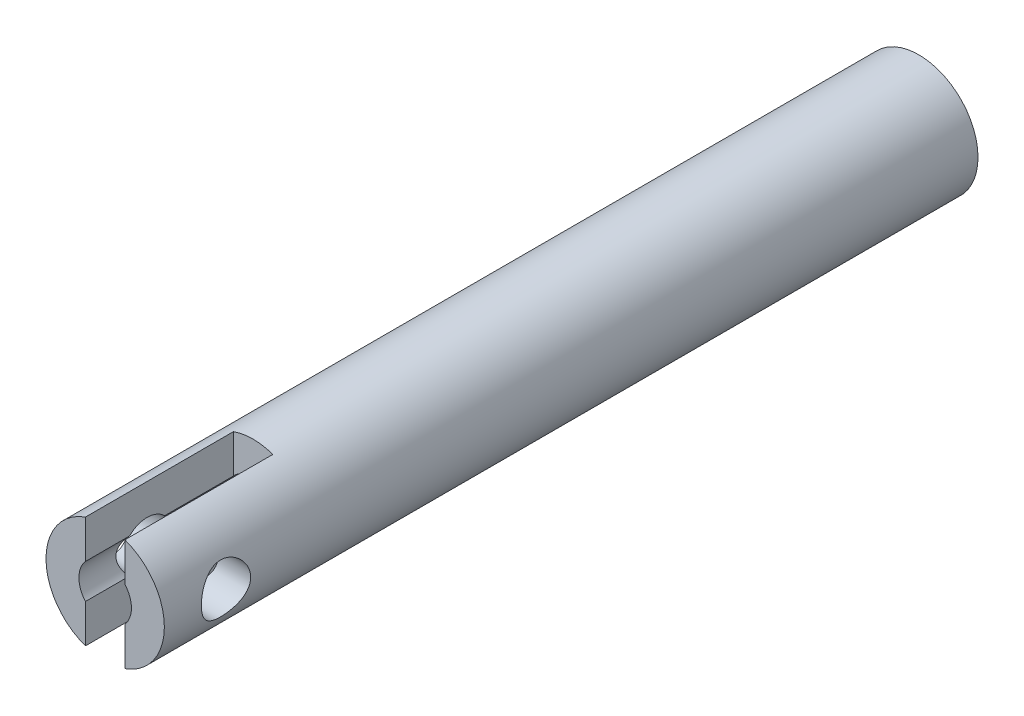
ISO-10303-21;
HEADER;
FILE_DESCRIPTION(('STEP AP214'),'2;1');
FILE_NAME('part.step','',(''),(''),'','','');
FILE_SCHEMA(('AUTOMOTIVE_DESIGN { 1 0 10303 214 1 1 1 1 }'));
ENDSEC;
DATA;
#1=APPLICATION_CONTEXT('core data for automotive mechanical design processes');
#2=APPLICATION_PROTOCOL_DEFINITION('international standard','automotive_design',2000,#1);
#3=PRODUCT_CONTEXT('',#1,'mechanical');
#4=PRODUCT('Part','Part','',(#3));
#5=PRODUCT_RELATED_PRODUCT_CATEGORY('part','',(#4));
#6=PRODUCT_DEFINITION_FORMATION('','',#4);
#7=PRODUCT_DEFINITION_CONTEXT('part definition',#1,'design');
#8=PRODUCT_DEFINITION('design','',#6,#7);
#9=PRODUCT_DEFINITION_SHAPE('','',#8);
#10=(LENGTH_UNIT() NAMED_UNIT(*) SI_UNIT(.MILLI.,.METRE.));
#11=(NAMED_UNIT(*) PLANE_ANGLE_UNIT() SI_UNIT($,.RADIAN.));
#12=(NAMED_UNIT(*) SI_UNIT($,.STERADIAN.) SOLID_ANGLE_UNIT());
#13=UNCERTAINTY_MEASURE_WITH_UNIT(LENGTH_MEASURE(1.E-05),#10,'distance_accuracy_value','');
#14=(GEOMETRIC_REPRESENTATION_CONTEXT(3) GLOBAL_UNCERTAINTY_ASSIGNED_CONTEXT((#13)) GLOBAL_UNIT_ASSIGNED_CONTEXT((#10,
#11,#12)) REPRESENTATION_CONTEXT('',''));
#15=CARTESIAN_POINT('',(0.,0.,0.));
#16=DIRECTION('',(0.,0.,1.));
#17=DIRECTION('',(1.,0.,0.));
#18=AXIS2_PLACEMENT_3D('',#15,#16,#17);
#19=CARTESIAN_POINT('',(0.,0.,41.91));
#20=DIRECTION('',(0.,0.,1.));
#21=DIRECTION('',(1.,0.,0.));
#22=AXIS2_PLACEMENT_3D('',#19,#20,#21);
#23=PLANE('',#22);
#24=DIRECTION('',(0.,-1.,0.));
#25=VECTOR('',#24,1.);
#26=CARTESIAN_POINT('',(1.016,0.,41.91));
#27=LINE('',#26,#25);
#28=CARTESIAN_POINT('',(1.016,2.87368195874212,41.91));
#29=VERTEX_POINT('',#28);
#30=CARTESIAN_POINT('',(1.016,0.892824452230101,41.91));
#31=VERTEX_POINT('',#30);
#32=EDGE_CURVE('E194',#29,#31,#27,.T.);
#33=ORIENTED_EDGE('',*,*,#32,.T.);
#34=CARTESIAN_POINT('',(0.,0.,41.91));
#35=DIRECTION('',(0.,0.,-1.));
#36=DIRECTION('',(-1.,0.,0.));
#37=AXIS2_PLACEMENT_3D('',#34,#35,#36);
#38=CIRCLE('',#37,1.35254999999999);
#39=CARTESIAN_POINT('',(1.016,-0.892824452230101,41.91));
#40=VERTEX_POINT('',#39);
#41=EDGE_CURVE('E180',#31,#40,#38,.T.);
#42=ORIENTED_EDGE('',*,*,#41,.T.);
#43=CARTESIAN_POINT('',(1.016,-2.87368195874212,41.91));
#44=VERTEX_POINT('',#43);
#45=EDGE_CURVE('E270',#40,#44,#27,.T.);
#46=ORIENTED_EDGE('',*,*,#45,.T.);
#47=CARTESIAN_POINT('',(0.,0.,41.91));
#48=DIRECTION('',(0.,0.,1.));
#49=DIRECTION('',(1.,0.,0.));
#50=AXIS2_PLACEMENT_3D('',#47,#48,#49);
#51=CIRCLE('',#50,3.04799999999999);
#52=EDGE_CURVE('E214',#44,#29,#51,.T.);
#53=ORIENTED_EDGE('',*,*,#52,.T.);
#54=EDGE_LOOP('',(#33,#42,#46,#53));
#55=FACE_BOUND('',#54,.T.);
#56=ADVANCED_FACE('F40',(#55),#23,.T.);
#57=CARTESIAN_POINT('',(1.016,0.,34.29));
#58=DIRECTION('',(-1.,0.,0.));
#59=DIRECTION('',(0.,0.,1.));
#60=AXIS2_PLACEMENT_3D('',#57,#58,#59);
#61=PLANE('',#60);
#62=DIRECTION('',(0.,0.,-1.));
#63=VECTOR('',#62,1.);
#64=CARTESIAN_POINT('',(1.016,0.892824452230099,0.));
#65=LINE('',#64,#63);
#66=CARTESIAN_POINT('',(1.016,0.892824452230099,39.6381968210197));
#67=VERTEX_POINT('',#66);
#68=EDGE_CURVE('E254',#31,#67,#65,.T.);
#69=ORIENTED_EDGE('',*,*,#68,.F.);
#70=ORIENTED_EDGE('',*,*,#32,.F.);
#71=DIRECTION('',(0.,0.,1.));
#72=VECTOR('',#71,1.);
#73=CARTESIAN_POINT('',(1.016,2.87368195874212,34.29));
#74=LINE('',#73,#72);
#75=CARTESIAN_POINT('',(1.016,2.87368195874212,34.29));
#76=VERTEX_POINT('',#75);
#77=EDGE_CURVE('E209',#76,#29,#74,.T.);
#78=ORIENTED_EDGE('',*,*,#77,.F.);
#79=DIRECTION('',(0.,-1.,0.));
#80=VECTOR('',#79,1.);
#81=CARTESIAN_POINT('',(1.016,0.,34.29));
#82=LINE('',#81,#80);
#83=CARTESIAN_POINT('',(1.016,0.892824452230099,34.29));
#84=VERTEX_POINT('',#83);
#85=EDGE_CURVE('E191',#76,#84,#82,.T.);
#86=ORIENTED_EDGE('',*,*,#85,.T.);
#87=CARTESIAN_POINT('',(1.016,0.892824452230099,37.8318031789803));
#88=VERTEX_POINT('',#87);
#89=EDGE_CURVE('E309',#88,#84,#65,.T.);
#90=ORIENTED_EDGE('',*,*,#89,.F.);
#91=CARTESIAN_POINT('',(1.016,0.,38.735));
#92=DIRECTION('',(-1.,0.,0.));
#93=DIRECTION('',(0.,0.,1.));
#94=AXIS2_PLACEMENT_3D('',#91,#92,#93);
#95=CIRCLE('',#94,1.27);
#96=EDGE_CURVE('E255',#67,#88,#95,.T.);
#97=ORIENTED_EDGE('',*,*,#96,.F.);
#98=EDGE_LOOP('',(#69,#70,#78,#86,#90,#97));
#99=FACE_BOUND('',#98,.T.);
#100=ADVANCED_FACE('F337',(#99),#61,.T.);
#101=CARTESIAN_POINT('',(-1.016,0.,34.29));
#102=DIRECTION('',(-1.,0.,0.));
#103=DIRECTION('',(0.,0.,1.));
#104=AXIS2_PLACEMENT_3D('',#101,#102,#103);
#105=PLANE('',#104);
#106=DIRECTION('',(0.,-1.,0.));
#107=VECTOR('',#106,1.);
#108=CARTESIAN_POINT('',(-1.016,0.,41.91));
#109=LINE('',#108,#107);
#110=CARTESIAN_POINT('',(-1.016,2.87368195874212,41.91));
#111=VERTEX_POINT('',#110);
#112=CARTESIAN_POINT('',(-1.016,0.892824452230103,41.91));
#113=VERTEX_POINT('',#112);
#114=EDGE_CURVE('E176',#111,#113,#109,.T.);
#115=ORIENTED_EDGE('',*,*,#114,.T.);
#116=DIRECTION('',(0.,0.,-1.));
#117=VECTOR('',#116,1.);
#118=CARTESIAN_POINT('',(-1.016,0.892824452230098,0.));
#119=LINE('',#118,#117);
#120=CARTESIAN_POINT('',(-1.016,0.892824452230098,39.6381968210197));
#121=VERTEX_POINT('',#120);
#122=EDGE_CURVE('E158',#113,#121,#119,.T.);
#123=ORIENTED_EDGE('',*,*,#122,.T.);
#124=CARTESIAN_POINT('',(-1.016,0.,38.735));
#125=DIRECTION('',(-1.,0.,0.));
#126=DIRECTION('',(0.,0.,1.));
#127=AXIS2_PLACEMENT_3D('',#124,#125,#126);
#128=CIRCLE('',#127,1.27);
#129=CARTESIAN_POINT('',(-1.016,0.892824452230098,37.8318031789803));
#130=VERTEX_POINT('',#129);
#131=EDGE_CURVE('E222',#121,#130,#128,.T.);
#132=ORIENTED_EDGE('',*,*,#131,.T.);
#133=CARTESIAN_POINT('',(-1.016,0.892824452230098,34.29));
#134=VERTEX_POINT('',#133);
#135=EDGE_CURVE('E170',#130,#134,#119,.T.);
#136=ORIENTED_EDGE('',*,*,#135,.T.);
#137=DIRECTION('',(0.,-1.,0.));
#138=VECTOR('',#137,1.);
#139=CARTESIAN_POINT('',(-1.016,0.,34.29));
#140=LINE('',#139,#138);
#141=CARTESIAN_POINT('',(-1.016,2.87368195874212,34.29));
#142=VERTEX_POINT('',#141);
#143=EDGE_CURVE('E278',#142,#134,#140,.T.);
#144=ORIENTED_EDGE('',*,*,#143,.F.);
#145=DIRECTION('',(0.,0.,1.));
#146=VECTOR('',#145,1.);
#147=CARTESIAN_POINT('',(-1.016,2.87368195874212,34.29));
#148=LINE('',#147,#146);
#149=EDGE_CURVE('E185',#142,#111,#148,.T.);
#150=ORIENTED_EDGE('',*,*,#149,.T.);
#151=EDGE_LOOP('',(#115,#123,#132,#136,#144,#150));
#152=FACE_BOUND('',#151,.T.);
#153=ADVANCED_FACE('F183',(#152),#105,.F.);
#154=CARTESIAN_POINT('',(0.,0.,34.29));
#155=DIRECTION('',(0.,0.,1.));
#156=DIRECTION('',(1.,0.,0.));
#157=AXIS2_PLACEMENT_3D('',#154,#155,#156);
#158=PLANE('',#157);
#159=CARTESIAN_POINT('',(0.,0.,34.29));
#160=DIRECTION('',(0.,0.,1.));
#161=DIRECTION('',(1.,0.,0.));
#162=AXIS2_PLACEMENT_3D('',#159,#160,#161);
#163=CIRCLE('',#162,1.35254999999999);
#164=EDGE_CURVE('E321',#84,#134,#163,.T.);
#165=ORIENTED_EDGE('',*,*,#164,.F.);
#166=ORIENTED_EDGE('',*,*,#85,.F.);
#167=CARTESIAN_POINT('',(0.,0.,34.29));
#168=DIRECTION('',(0.,0.,1.));
#169=DIRECTION('',(1.,0.,0.));
#170=AXIS2_PLACEMENT_3D('',#167,#168,#169);
#171=CIRCLE('',#170,3.04799999999999);
#172=EDGE_CURVE('E274',#76,#142,#171,.T.);
#173=ORIENTED_EDGE('',*,*,#172,.T.);
#174=ORIENTED_EDGE('',*,*,#143,.T.);
#175=EDGE_LOOP('',(#165,#166,#173,#174));
#176=FACE_BOUND('',#175,.T.);
#177=ADVANCED_FACE('F334',(#176),#158,.T.);
#178=CARTESIAN_POINT('',(0.,0.,41.91));
#179=DIRECTION('',(0.,0.,-1.));
#180=DIRECTION('',(-1.,0.,0.));
#181=AXIS2_PLACEMENT_3D('',#178,#179,#180);
#182=CYLINDRICAL_SURFACE('',#181,3.04799999999999);
#183=CARTESIAN_POINT('',(-3.04799999999999,0.,37.465));
#184=CARTESIAN_POINT('',(-3.04799449701148,0.0680293814784471,37.4650073203728));
#185=CARTESIAN_POINT('',(-3.04569604702305,0.136165739416862,37.4704985498646));
#186=CARTESIAN_POINT('',(-3.03672396036824,0.270507329094848,37.4922684899589));
#187=CARTESIAN_POINT('',(-3.03003890715444,0.336707049646341,37.5085753504557));
#188=CARTESIAN_POINT('',(-3.01301189662737,0.465011753391537,37.5512696692491));
#189=CARTESIAN_POINT('',(-3.00268233574603,0.527129780817089,37.5776229796996));
#190=CARTESIAN_POINT('',(-2.97937211054194,0.64600303278668,37.6395211884043));
#191=CARTESIAN_POINT('',(-2.96639224950334,0.702759874656194,37.6750633024744));
#192=CARTESIAN_POINT('',(-2.93835153605498,0.812239578016464,37.7562150463123));
#193=CARTESIAN_POINT('',(-2.9232225337931,0.864657927798054,37.8022117297304));
#194=CARTESIAN_POINT('',(-2.89288437493609,0.961298378228723,37.9021485641391));
#195=CARTESIAN_POINT('',(-2.87767518044518,1.00551616336353,37.9560928708928));
#196=CARTESIAN_POINT('',(-2.84806158162002,1.08664997500218,38.0736112060059));
#197=CARTESIAN_POINT('',(-2.83373359463358,1.12309969084388,38.1375284476014));
#198=CARTESIAN_POINT('',(-2.80858541514717,1.18459443638287,38.2712704300477));
#199=CARTESIAN_POINT('',(-2.79776341640836,1.20964534129671,38.3410921055562));
#200=CARTESIAN_POINT('',(-2.78159012273908,1.24637391885153,38.4811561508362));
#201=CARTESIAN_POINT('',(-2.77600041854215,1.25863764403647,38.5512162511264));
#202=CARTESIAN_POINT('',(-2.77023907439015,1.27127213327281,38.6926056653695));
#203=CARTESIAN_POINT('',(-2.77006444640063,1.27164945623268,38.7639342576261));
#204=CARTESIAN_POINT('',(-2.77495121473826,1.26094185569492,38.8999984614019));
#205=CARTESIAN_POINT('',(-2.779612248472,1.25073340010097,38.9648203141095));
#206=CARTESIAN_POINT('',(-2.79296858498177,1.22061418072029,39.0917298844564));
#207=CARTESIAN_POINT('',(-2.8016646603482,1.20070155883772,39.1538170759956));
#208=CARTESIAN_POINT('',(-2.8223076372912,1.15135110067212,39.2750626262393));
#209=CARTESIAN_POINT('',(-2.83431977660322,1.12171959083864,39.334130547648));
#210=CARTESIAN_POINT('',(-2.86022624439343,1.05390942461851,39.4466853776222));
#211=CARTESIAN_POINT('',(-2.87412131427856,1.01572739756785,39.5001700730233));
#212=CARTESIAN_POINT('',(-2.90365664508026,0.928111900992533,39.6047975580726));
#213=CARTESIAN_POINT('',(-2.91934515346944,0.878000258938844,39.6553604324636));
#214=CARTESIAN_POINT('',(-2.94970883882329,0.769853264508333,39.7475593190065));
#215=CARTESIAN_POINT('',(-2.96438377787042,0.711816061199628,39.7891932400393));
#216=CARTESIAN_POINT('',(-2.99149296093376,0.587703115872468,39.8632027967941));
#217=CARTESIAN_POINT('',(-3.00386766808026,0.521472751766844,39.8953425562731));
#218=CARTESIAN_POINT('',(-3.0245251311744,0.383898040967263,39.9478206778369));
#219=CARTESIAN_POINT('',(-3.03281014819332,0.312556545111757,39.9681655620549));
#220=CARTESIAN_POINT('',(-3.04393235445366,0.171630963159769,39.9952626480007));
#221=CARTESIAN_POINT('',(-3.04708093703878,0.102221065843099,40.0027931031629));
#222=CARTESIAN_POINT('',(-3.04856947174644,-0.0369363299840251,40.0063677631919));
#223=CARTESIAN_POINT('',(-3.0469108044333,-0.106683725827077,40.002415265776));
#224=CARTESIAN_POINT('',(-3.03917317139451,-0.240891814218898,39.983693377837));
#225=CARTESIAN_POINT('',(-3.03331765480533,-0.305443094105616,39.9694705266372));
#226=CARTESIAN_POINT('',(-3.01801384480772,-0.431172872954627,39.9313723143466));
#227=CARTESIAN_POINT('',(-3.00856509751058,-0.492350944702654,39.9074957337945));
#228=CARTESIAN_POINT('',(-2.98661602975488,-0.611742743867041,39.8499878886765));
#229=CARTESIAN_POINT('',(-2.97403003332789,-0.669805352645008,39.8160766459236));
#230=CARTESIAN_POINT('',(-2.94714985452355,-0.77962375569113,39.7397697681636));
#231=CARTESIAN_POINT('',(-2.93285495997032,-0.831376902243571,39.6973705908463));
#232=CARTESIAN_POINT('',(-2.90283481301764,-0.930994765158649,39.6017463149952));
#233=CARTESIAN_POINT('',(-2.88708034816485,-0.978317269147509,39.547964080966));
#234=CARTESIAN_POINT('',(-2.85683286156293,-1.06341656364319,39.4329703836496));
#235=CARTESIAN_POINT('',(-2.84234012677333,-1.10119118634187,39.3717572378655));
#236=CARTESIAN_POINT('',(-2.81616288423891,-1.16653015572038,39.2423759978926));
#237=CARTESIAN_POINT('',(-2.80452131555993,-1.19394140929126,39.1741212599169));
#238=CARTESIAN_POINT('',(-2.785956893495,-1.23664892574798,39.0333274766889));
#239=CARTESIAN_POINT('',(-2.77903014988644,-1.25195517821506,38.9607920173169));
#240=CARTESIAN_POINT('',(-2.7712737516986,-1.26902545634483,38.8195122016136));
#241=CARTESIAN_POINT('',(-2.77001580582637,-1.27174122499739,38.7509058231107));
#242=CARTESIAN_POINT('',(-2.772601546592,-1.26609424732295,38.6142556530806));
#243=CARTESIAN_POINT('',(-2.77644445004951,-1.25773320172157,38.5462117768013));
#244=CARTESIAN_POINT('',(-2.78840744123104,-1.23096939256979,38.4158817685716));
#245=CARTESIAN_POINT('',(-2.79632008524023,-1.21305222028609,38.3534750597612));
#246=CARTESIAN_POINT('',(-2.81536832098375,-1.16815949453369,38.2325392103011));
#247=CARTESIAN_POINT('',(-2.826504818218,-1.14118139573528,38.1740111647548));
#248=CARTESIAN_POINT('',(-2.85157625832973,-1.07706450510457,38.0586529697157));
#249=CARTESIAN_POINT('',(-2.86563920357098,-1.03941230685051,38.002136512549));
#250=CARTESIAN_POINT('',(-2.894621480787,-0.955735017792474,37.8959260984095));
#251=CARTESIAN_POINT('',(-2.90954110847408,-0.909707023768106,37.8462345175898));
#252=CARTESIAN_POINT('',(-2.93986095135707,-0.80660447851128,37.7513609394083));
#253=CARTESIAN_POINT('',(-2.9552170259198,-0.748969535788212,37.7067709842339));
#254=CARTESIAN_POINT('',(-2.98358705919972,-0.626465680521252,37.6278653551997));
#255=CARTESIAN_POINT('',(-2.99659994955408,-0.56159348991288,37.5935543632722));
#256=CARTESIAN_POINT('',(-3.01862930296259,-0.427463769625441,37.5369227970331));
#257=CARTESIAN_POINT('',(-3.02770827103275,-0.35829645483633,37.5144133971168));
#258=CARTESIAN_POINT('',(-3.04110145924922,-0.216824988596107,37.4815543696569));
#259=CARTESIAN_POINT('',(-3.04543059504958,-0.144531402052655,37.4711666703896));
#260=CARTESIAN_POINT('',(-3.04771844170036,-0.0479918592298915,37.4656775083362));
#261=CARTESIAN_POINT('',(-3.04800194160176,-0.0240025881904682,37.4649974171764));
#262=CARTESIAN_POINT('',(-3.04799999999999,0.,37.465));
#263=B_SPLINE_CURVE_WITH_KNOTS('',3,(#183,#184,#185,#186,#187,#188,#189,#190,#191,#192,#193,
#194,#195,#196,#197,#198,#199,#200,#201,#202,#203,#204,#205,#206,#207,#208,#209,#210,#211,#212,
#213,#214,#215,#216,#217,#218,#219,#220,#221,#222,#223,#224,#225,#226,#227,#228,#229,#230,#231,
#232,#233,#234,#235,#236,#237,#238,#239,#240,#241,#242,#243,#244,#245,#246,#247,#248,#249,#250,
#251,#252,#253,#254,#255,#256,#257,#258,#259,#260,#261,#262),.UNSPECIFIED.,.T.,.F.,(4,2,2,2,2,2,
2,2,2,2,2,2,2,2,2,2,2,2,2,2,2,2,2,2,2,2,2,2,2,2,2,2,2,2,2,2,2,2,2,4),(0.,0.204019829586082,
0.408572757278755,0.612436521536802,0.816238587842622,1.02939023269428,1.24265373141569,
1.46641032131751,1.69005145078277,1.90291997507757,2.11567103661031,2.31211279717797,
2.50859218602847,2.70925252467653,2.90999210448682,3.12769647385943,3.34545177303621,
3.56823319941786,3.79089131805789,3.99946818487542,4.20798515773062,4.40615415171492,
4.60434818627413,4.80869889436515,5.01313506357007,5.23218143837761,5.45127750220185,
5.67349424973274,5.89552742227772,6.10046915600597,6.30537942678296,6.50075052364198,
6.69617654869821,6.903353156918,7.11060171400758,7.33294479564966,7.55538899819438,
7.77415621512494,7.99223446476829,8.06421812603083),.UNSPECIFIED.);
#264=CARTESIAN_POINT('',(-3.04799999999999,0.,37.465));
#265=VERTEX_POINT('',#264);
#266=EDGE_CURVE('E265',#265,#265,#263,.T.);
#267=ORIENTED_EDGE('',*,*,#266,.T.);
#268=EDGE_LOOP('',(#267));
#269=FACE_BOUND('',#268,.T.);
#270=CARTESIAN_POINT('',(3.04799999999999,0.,37.465));
#271=CARTESIAN_POINT('',(3.04799449701148,-0.0680293814784471,37.4650073203728));
#272=CARTESIAN_POINT('',(3.04569604702305,-0.136165739416862,37.4704985498646));
#273=CARTESIAN_POINT('',(3.03672396036824,-0.270507329094848,37.4922684899589));
#274=CARTESIAN_POINT('',(3.03003890715444,-0.336707049646341,37.5085753504557));
#275=CARTESIAN_POINT('',(3.01301189662737,-0.465011753391537,37.5512696692491));
#276=CARTESIAN_POINT('',(3.00268233574603,-0.52712978081709,37.5776229796996));
#277=CARTESIAN_POINT('',(2.97937211054194,-0.64600303278668,37.6395211884043));
#278=CARTESIAN_POINT('',(2.96639224950334,-0.702759874656194,37.6750633024744));
#279=CARTESIAN_POINT('',(2.93835153605498,-0.812239578016463,37.7562150463123));
#280=CARTESIAN_POINT('',(2.9232225337931,-0.864657927798052,37.8022117297304));
#281=CARTESIAN_POINT('',(2.89288437493609,-0.961298378228722,37.9021485641391));
#282=CARTESIAN_POINT('',(2.87767518044518,-1.00551616336353,37.9560928708928));
#283=CARTESIAN_POINT('',(2.84806158162002,-1.08664997500218,38.0736112060059));
#284=CARTESIAN_POINT('',(2.83373359463358,-1.12309969084388,38.1375284476014));
#285=CARTESIAN_POINT('',(2.80858541514717,-1.18459443638287,38.2712704300477));
#286=CARTESIAN_POINT('',(2.79776341640836,-1.20964534129671,38.3410921055562));
#287=CARTESIAN_POINT('',(2.78159012273908,-1.24637391885153,38.4811561508362));
#288=CARTESIAN_POINT('',(2.77600041854215,-1.25863764403647,38.5512162511264));
#289=CARTESIAN_POINT('',(2.77023907439015,-1.27127213327281,38.6926056653695));
#290=CARTESIAN_POINT('',(2.77006444640063,-1.27164945623268,38.7639342576261));
#291=CARTESIAN_POINT('',(2.77495121473826,-1.26094185569492,38.8999984614019));
#292=CARTESIAN_POINT('',(2.779612248472,-1.25073340010097,38.9648203141095));
#293=CARTESIAN_POINT('',(2.79296858498177,-1.22061418072029,39.0917298844564));
#294=CARTESIAN_POINT('',(2.8016646603482,-1.20070155883772,39.1538170759956));
#295=CARTESIAN_POINT('',(2.8223076372912,-1.15135110067212,39.2750626262393));
#296=CARTESIAN_POINT('',(2.83431977660322,-1.12171959083864,39.334130547648));
#297=CARTESIAN_POINT('',(2.86022624439343,-1.05390942461851,39.4466853776222));
#298=CARTESIAN_POINT('',(2.87412131427856,-1.01572739756785,39.5001700730233));
#299=CARTESIAN_POINT('',(2.90365664508026,-0.928111900992533,39.6047975580726));
#300=CARTESIAN_POINT('',(2.91934515346944,-0.878000258938844,39.6553604324636));
#301=CARTESIAN_POINT('',(2.94970883882329,-0.769853264508333,39.7475593190065));
#302=CARTESIAN_POINT('',(2.96438377787042,-0.711816061199628,39.7891932400393));
#303=CARTESIAN_POINT('',(2.99149296093376,-0.587703115872468,39.8632027967941));
#304=CARTESIAN_POINT('',(3.00386766808026,-0.521472751766842,39.8953425562731));
#305=CARTESIAN_POINT('',(3.0245251311744,-0.383898040967261,39.9478206778369));
#306=CARTESIAN_POINT('',(3.03281014819332,-0.312556545111756,39.9681655620549));
#307=CARTESIAN_POINT('',(3.04393235445366,-0.171630963159768,39.9952626480007));
#308=CARTESIAN_POINT('',(3.04708093703878,-0.102221065843098,40.0027931031629));
#309=CARTESIAN_POINT('',(3.04856947174644,0.036936329984026,40.0063677631919));
#310=CARTESIAN_POINT('',(3.0469108044333,0.106683725827078,40.002415265776));
#311=CARTESIAN_POINT('',(3.03917317139451,0.240891814218898,39.983693377837));
#312=CARTESIAN_POINT('',(3.03331765480533,0.305443094105616,39.9694705266372));
#313=CARTESIAN_POINT('',(3.01801384480772,0.431172872954628,39.9313723143466));
#314=CARTESIAN_POINT('',(3.00856509751058,0.492350944702654,39.9074957337945));
#315=CARTESIAN_POINT('',(2.98661602975488,0.611742743867042,39.8499878886765));
#316=CARTESIAN_POINT('',(2.97403003332789,0.669805352645008,39.8160766459236));
#317=CARTESIAN_POINT('',(2.94714985452355,0.779623755691131,39.7397697681636));
#318=CARTESIAN_POINT('',(2.93285495997032,0.831376902243571,39.6973705908463));
#319=CARTESIAN_POINT('',(2.90283481301764,0.93099476515865,39.6017463149952));
#320=CARTESIAN_POINT('',(2.88708034816485,0.978317269147509,39.547964080966));
#321=CARTESIAN_POINT('',(2.85683286156293,1.06341656364319,39.4329703836496));
#322=CARTESIAN_POINT('',(2.84234012677333,1.10119118634187,39.3717572378655));
#323=CARTESIAN_POINT('',(2.81616288423891,1.16653015572038,39.2423759978926));
#324=CARTESIAN_POINT('',(2.80452131555993,1.19394140929126,39.1741212599169));
#325=CARTESIAN_POINT('',(2.785956893495,1.23664892574798,39.0333274766889));
#326=CARTESIAN_POINT('',(2.77903014988644,1.25195517821506,38.9607920173169));
#327=CARTESIAN_POINT('',(2.7712737516986,1.26902545634483,38.8195122016136));
#328=CARTESIAN_POINT('',(2.77001580582637,1.27174122499739,38.7509058231107));
#329=CARTESIAN_POINT('',(2.772601546592,1.26609424732295,38.6142556530806));
#330=CARTESIAN_POINT('',(2.77644445004951,1.25773320172157,38.5462117768013));
#331=CARTESIAN_POINT('',(2.78840744123104,1.23096939256979,38.4158817685716));
#332=CARTESIAN_POINT('',(2.79632008524023,1.21305222028609,38.3534750597612));
#333=CARTESIAN_POINT('',(2.81536832098375,1.16815949453368,38.232539210301));
#334=CARTESIAN_POINT('',(2.826504818218,1.14118139573528,38.1740111647548));
#335=CARTESIAN_POINT('',(2.85157625832973,1.07706450510457,38.0586529697157));
#336=CARTESIAN_POINT('',(2.86563920357098,1.03941230685051,38.002136512549));
#337=CARTESIAN_POINT('',(2.894621480787,0.955735017792473,37.8959260984095));
#338=CARTESIAN_POINT('',(2.90954110847408,0.909707023768105,37.8462345175898));
#339=CARTESIAN_POINT('',(2.93986095135707,0.80660447851128,37.7513609394083));
#340=CARTESIAN_POINT('',(2.9552170259198,0.748969535788212,37.7067709842339));
#341=CARTESIAN_POINT('',(2.98358705919972,0.626465680521252,37.6278653551997));
#342=CARTESIAN_POINT('',(2.99659994955408,0.56159348991288,37.5935543632722));
#343=CARTESIAN_POINT('',(3.01862930296259,0.427463769625441,37.5369227970331));
#344=CARTESIAN_POINT('',(3.02770827103275,0.358296454836329,37.5144133971168));
#345=CARTESIAN_POINT('',(3.04110145924922,0.216824988596106,37.4815543696569));
#346=CARTESIAN_POINT('',(3.04543059504958,0.144531402052655,37.4711666703896));
#347=CARTESIAN_POINT('',(3.04771844170036,0.0479918592298915,37.4656775083362));
#348=CARTESIAN_POINT('',(3.04800194160176,0.0240025881904682,37.4649974171764));
#349=CARTESIAN_POINT('',(3.04799999999999,0.,37.465));
#350=B_SPLINE_CURVE_WITH_KNOTS('',3,(#270,#271,#272,#273,#274,#275,#276,#277,#278,#279,#280,
#281,#282,#283,#284,#285,#286,#287,#288,#289,#290,#291,#292,#293,#294,#295,#296,#297,#298,#299,
#300,#301,#302,#303,#304,#305,#306,#307,#308,#309,#310,#311,#312,#313,#314,#315,#316,#317,#318,
#319,#320,#321,#322,#323,#324,#325,#326,#327,#328,#329,#330,#331,#332,#333,#334,#335,#336,#337,
#338,#339,#340,#341,#342,#343,#344,#345,#346,#347,#348,#349),.UNSPECIFIED.,.T.,.F.,(4,2,2,2,2,2,
2,2,2,2,2,2,2,2,2,2,2,2,2,2,2,2,2,2,2,2,2,2,2,2,2,2,2,2,2,2,2,2,2,4),(0.,0.204019829586082,
0.408572757278755,0.612436521536802,0.816238587842622,1.02939023269428,1.24265373141569,
1.46641032131751,1.69005145078277,1.90291997507757,2.11567103661031,2.31211279717797,
2.50859218602847,2.70925252467653,2.90999210448682,3.12769647385943,3.34545177303621,
3.56823319941786,3.79089131805789,3.99946818487542,4.20798515773062,4.40615415171492,
4.60434818627413,4.80869889436515,5.01313506357007,5.23218143837761,5.45127750220186,
5.67349424973275,5.89552742227773,6.10046915600597,6.30537942678296,6.50075052364199,
6.69617654869822,6.903353156918,7.11060171400758,7.33294479564967,7.55538899819438,
7.77415621512494,7.99223446476829,8.06421812603083),.UNSPECIFIED.);
#351=CARTESIAN_POINT('',(3.04799999999999,0.,37.465));
#352=VERTEX_POINT('',#351);
#353=EDGE_CURVE('E259',#352,#352,#350,.T.);
#354=ORIENTED_EDGE('',*,*,#353,.T.);
#355=EDGE_LOOP('',(#354));
#356=FACE_BOUND('',#355,.T.);
#357=CARTESIAN_POINT('',(0.,0.,0.));
#358=DIRECTION('',(0.,0.,1.));
#359=DIRECTION('',(1.,0.,0.));
#360=AXIS2_PLACEMENT_3D('',#357,#358,#359);
#361=CIRCLE('',#360,3.04799999999999);
#362=CARTESIAN_POINT('',(3.04799999999999,0.,0.));
#363=VERTEX_POINT('',#362);
#364=EDGE_CURVE('E202',#363,#363,#361,.T.);
#365=ORIENTED_EDGE('',*,*,#364,.T.);
#366=EDGE_LOOP('',(#365));
#367=FACE_BOUND('',#366,.T.);
#368=ORIENTED_EDGE('',*,*,#77,.T.);
#369=ORIENTED_EDGE('',*,*,#52,.F.);
#370=DIRECTION('',(0.,0.,1.));
#371=VECTOR('',#370,1.);
#372=CARTESIAN_POINT('',(1.016,-2.87368195874212,34.29));
#373=LINE('',#372,#371);
#374=CARTESIAN_POINT('',(1.016,-2.87368195874212,34.29));
#375=VERTEX_POINT('',#374);
#376=EDGE_CURVE('E198',#375,#44,#373,.T.);
#377=ORIENTED_EDGE('',*,*,#376,.F.);
#378=CARTESIAN_POINT('',(-1.016,-2.87368195874212,34.29));
#379=VERTEX_POINT('',#378);
#380=EDGE_CURVE('E213',#379,#375,#171,.T.);
#381=ORIENTED_EDGE('',*,*,#380,.F.);
#382=DIRECTION('',(0.,0.,1.));
#383=VECTOR('',#382,1.);
#384=CARTESIAN_POINT('',(-1.016,-2.87368195874212,34.29));
#385=LINE('',#384,#383);
#386=CARTESIAN_POINT('',(-1.016,-2.87368195874212,41.91));
#387=VERTEX_POINT('',#386);
#388=EDGE_CURVE('E203',#379,#387,#385,.T.);
#389=ORIENTED_EDGE('',*,*,#388,.T.);
#390=EDGE_CURVE('E218',#111,#387,#51,.T.);
#391=ORIENTED_EDGE('',*,*,#390,.F.);
#392=ORIENTED_EDGE('',*,*,#149,.F.);
#393=ORIENTED_EDGE('',*,*,#172,.F.);
#394=EDGE_LOOP('',(#368,#369,#377,#381,#389,#391,#392,#393));
#395=FACE_BOUND('',#394,.T.);
#396=ADVANCED_FACE('F42',(#269,#356,#367,#395),#182,.T.);
#397=CARTESIAN_POINT('',(-1.016,-0.8928244522301,41.91));
#398=VERTEX_POINT('',#397);
#399=EDGE_CURVE('E161',#398,#113,#38,.T.);
#400=ORIENTED_EDGE('',*,*,#399,.T.);
#401=ORIENTED_EDGE('',*,*,#114,.F.);
#402=ORIENTED_EDGE('',*,*,#390,.T.);
#403=EDGE_CURVE('E178',#398,#387,#109,.T.);
#404=ORIENTED_EDGE('',*,*,#403,.F.);
#405=EDGE_LOOP('',(#400,#401,#402,#404));
#406=FACE_BOUND('',#405,.T.);
#407=ADVANCED_FACE('F174',(#406),#23,.T.);
#408=CARTESIAN_POINT('',(0.,0.,0.));
#409=DIRECTION('',(0.,0.,1.));
#410=DIRECTION('',(1.,0.,0.));
#411=AXIS2_PLACEMENT_3D('',#408,#409,#410);
#412=PLANE('',#411);
#413=CARTESIAN_POINT('',(0.,0.,0.));
#414=DIRECTION('',(0.,0.,-1.));
#415=DIRECTION('',(-1.,0.,0.));
#416=AXIS2_PLACEMENT_3D('',#413,#414,#415);
#417=CIRCLE('',#416,1.35254999999999);
#418=CARTESIAN_POINT('',(-1.35254999999999,0.,0.));
#419=VERTEX_POINT('',#418);
#420=EDGE_CURVE('E181',#419,#419,#417,.T.);
#421=ORIENTED_EDGE('',*,*,#420,.F.);
#422=EDGE_LOOP('',(#421));
#423=FACE_BOUND('',#422,.T.);
#424=ORIENTED_EDGE('',*,*,#364,.F.);
#425=EDGE_LOOP('',(#424));
#426=FACE_BOUND('',#425,.T.);
#427=ADVANCED_FACE('F356',(#423,#426),#412,.F.);
#428=DIRECTION('',(0.,0.,-1.));
#429=VECTOR('',#428,1.);
#430=CARTESIAN_POINT('',(1.016,-0.892824452230099,0.));
#431=LINE('',#430,#429);
#432=CARTESIAN_POINT('',(1.016,-0.892824452230099,34.29));
#433=VERTEX_POINT('',#432);
#434=CARTESIAN_POINT('',(1.016,-0.892824452230099,37.8318031789803));
#435=VERTEX_POINT('',#434);
#436=EDGE_CURVE('E75',#433,#435,#431,.F.);
#437=ORIENTED_EDGE('',*,*,#436,.F.);
#438=EDGE_CURVE('E187',#433,#375,#82,.T.);
#439=ORIENTED_EDGE('',*,*,#438,.T.);
#440=ORIENTED_EDGE('',*,*,#376,.T.);
#441=ORIENTED_EDGE('',*,*,#45,.F.);
#442=CARTESIAN_POINT('',(1.016,-0.892824452230099,39.6381968210197));
#443=VERTEX_POINT('',#442);
#444=EDGE_CURVE('E248',#443,#40,#431,.F.);
#445=ORIENTED_EDGE('',*,*,#444,.F.);
#446=EDGE_CURVE('E224',#435,#443,#95,.T.);
#447=ORIENTED_EDGE('',*,*,#446,.F.);
#448=EDGE_LOOP('',(#437,#439,#440,#441,#445,#447));
#449=FACE_BOUND('',#448,.T.);
#450=ADVANCED_FACE('F304',(#449),#61,.T.);
#451=CARTESIAN_POINT('',(-1.016,-0.892824452230098,34.29));
#452=VERTEX_POINT('',#451);
#453=EDGE_CURVE('E277',#452,#379,#140,.T.);
#454=ORIENTED_EDGE('',*,*,#453,.F.);
#455=DIRECTION('',(0.,0.,-1.));
#456=VECTOR('',#455,1.);
#457=CARTESIAN_POINT('',(-1.016,-0.892824452230098,0.));
#458=LINE('',#457,#456);
#459=CARTESIAN_POINT('',(-1.016,-0.892824452230098,37.8318031789803));
#460=VERTEX_POINT('',#459);
#461=EDGE_CURVE('E322',#452,#460,#458,.F.);
#462=ORIENTED_EDGE('',*,*,#461,.T.);
#463=CARTESIAN_POINT('',(-1.016,-0.892824452230098,39.6381968210197));
#464=VERTEX_POINT('',#463);
#465=EDGE_CURVE('E168',#460,#464,#128,.T.);
#466=ORIENTED_EDGE('',*,*,#465,.T.);
#467=EDGE_CURVE('E65',#464,#398,#458,.F.);
#468=ORIENTED_EDGE('',*,*,#467,.T.);
#469=ORIENTED_EDGE('',*,*,#403,.T.);
#470=ORIENTED_EDGE('',*,*,#388,.F.);
#471=EDGE_LOOP('',(#454,#462,#466,#468,#469,#470));
#472=FACE_BOUND('',#471,.T.);
#473=ADVANCED_FACE('F299',(#472),#105,.F.);
#474=EDGE_CURVE('E296',#452,#433,#163,.T.);
#475=ORIENTED_EDGE('',*,*,#474,.F.);
#476=ORIENTED_EDGE('',*,*,#453,.T.);
#477=ORIENTED_EDGE('',*,*,#380,.T.);
#478=ORIENTED_EDGE('',*,*,#438,.F.);
#479=EDGE_LOOP('',(#475,#476,#477,#478));
#480=FACE_BOUND('',#479,.T.);
#481=ADVANCED_FACE('F292',(#480),#158,.T.);
#482=CARTESIAN_POINT('',(-3.048,0.,38.735));
#483=DIRECTION('',(1.,0.,0.));
#484=DIRECTION('',(0.,0.,-1.));
#485=AXIS2_PLACEMENT_3D('',#482,#483,#484);
#486=CYLINDRICAL_SURFACE('',#485,1.27);
#487=ORIENTED_EDGE('',*,*,#465,.F.);
#488=CARTESIAN_POINT('',(-1.016,-0.892824452230098,37.8318031789803));
#489=CARTESIAN_POINT('',(-1.05437297441515,-0.849196855235648,37.7886740503527));
#490=CARTESIAN_POINT('',(-1.09124966343483,-0.801513027896756,37.747801968812));
#491=CARTESIAN_POINT('',(-1.16029081498084,-0.697864023352159,37.6719617390723));
#492=CARTESIAN_POINT('',(-1.19241191929603,-0.641831005816169,37.6370475181707));
#493=CARTESIAN_POINT('',(-1.24414166450793,-0.533297881683099,37.5811010769216));
#494=CARTESIAN_POINT('',(-1.2649670954356,-0.482103803550807,37.5586935007952));
#495=CARTESIAN_POINT('',(-1.3005928020296,-0.375490791558436,37.5204632236255));
#496=CARTESIAN_POINT('',(-1.31541247516761,-0.320086156833575,37.5046193194034));
#497=CARTESIAN_POINT('',(-1.33808500937487,-0.205762918728404,37.4804092748506));
#498=CARTESIAN_POINT('',(-1.3458810602975,-0.146819703123948,37.4721041071425));
#499=CARTESIAN_POINT('',(-1.35357691807436,-0.0278016921379335,37.4639054889687));
#500=CARTESIAN_POINT('',(-1.35347504532655,0.0322733412245099,37.4640138277508));
#501=CARTESIAN_POINT('',(-1.34586172740586,0.144340758020166,37.4721248626425));
#502=CARTESIAN_POINT('',(-1.33920941194996,0.196463735419827,37.4792122215627));
#503=CARTESIAN_POINT('',(-1.32023942865581,0.298407838058669,37.4994624031014));
#504=CARTESIAN_POINT('',(-1.30792336029121,0.348229608802356,37.5126235104652));
#505=CARTESIAN_POINT('',(-1.27784072698841,0.446373334859624,37.5448653576156));
#506=CARTESIAN_POINT('',(-1.25988847473384,0.494570583471604,37.5641480646925));
#507=CARTESIAN_POINT('',(-1.21964542667451,0.58685331863327,37.6075651044548));
#508=CARTESIAN_POINT('',(-1.19734738648302,0.630931755095296,37.6317075404989));
#509=CARTESIAN_POINT('',(-1.14980561198648,0.713850573715653,37.6834929005685));
#510=CARTESIAN_POINT('',(-1.12462269124299,0.752771509751513,37.7110643333194));
#511=CARTESIAN_POINT('',(-1.0719022092048,0.826102907569699,37.7692734580919));
#512=CARTESIAN_POINT('',(-1.04437724993974,0.860535263294152,37.7998948740786));
#513=CARTESIAN_POINT('',(-1.016,0.892824452230097,37.8318031789803));
#514=B_SPLINE_CURVE_WITH_KNOTS('',3,(#488,#489,#490,#491,#492,#493,#494,#495,#496,#497,#498,
#499,#500,#501,#502,#503,#504,#505,#506,#507,#508,#509,#510,#511,#512,#513),.UNSPECIFIED.,.F.,
.F.,(4,2,2,2,2,2,2,2,2,2,2,2,4),(0.,0.217408455028676,0.436690918844564,0.614876260425628,
0.792481420014909,0.971510556525645,1.15057776614811,1.30891537313641,1.46720829218401,
1.63138874121501,1.79584525524624,1.95731671987383,2.11796849245333),.UNSPECIFIED.);
#515=EDGE_CURVE('E242',#460,#130,#514,.T.);
#516=ORIENTED_EDGE('',*,*,#515,.T.);
#517=ORIENTED_EDGE('',*,*,#131,.F.);
#518=CARTESIAN_POINT('',(-1.016,0.892824452230098,39.6381968210197));
#519=CARTESIAN_POINT('',(-1.05437297441515,0.849196855235648,39.6813259496473));
#520=CARTESIAN_POINT('',(-1.09124966343483,0.801513027896756,39.722198031188));
#521=CARTESIAN_POINT('',(-1.16029081498084,0.697864023352159,39.7980382609277));
#522=CARTESIAN_POINT('',(-1.19241191929603,0.641831005816169,39.8329524818293));
#523=CARTESIAN_POINT('',(-1.24414166450793,0.533297881683099,39.8888989230784));
#524=CARTESIAN_POINT('',(-1.2649670954356,0.482103803550807,39.9113064992048));
#525=CARTESIAN_POINT('',(-1.3005928020296,0.375490791558436,39.9495367763745));
#526=CARTESIAN_POINT('',(-1.31541247516761,0.320086156833575,39.9653806805966));
#527=CARTESIAN_POINT('',(-1.33808500937487,0.205762918728404,39.9895907251494));
#528=CARTESIAN_POINT('',(-1.3458810602975,0.146819703123948,39.9978958928575));
#529=CARTESIAN_POINT('',(-1.35357691807436,0.0278016921379335,40.0060945110313));
#530=CARTESIAN_POINT('',(-1.35347504532655,-0.0322733412245099,40.0059861722492));
#531=CARTESIAN_POINT('',(-1.34586172740586,-0.144340758020166,39.9978751373575));
#532=CARTESIAN_POINT('',(-1.33920941194996,-0.196463735419827,39.9907877784373));
#533=CARTESIAN_POINT('',(-1.32023942865581,-0.298407838058669,39.9705375968986));
#534=CARTESIAN_POINT('',(-1.30792336029121,-0.348229608802356,39.9573764895348));
#535=CARTESIAN_POINT('',(-1.27784072698841,-0.446373334859624,39.9251346423844));
#536=CARTESIAN_POINT('',(-1.25988847473384,-0.494570583471604,39.9058519353075));
#537=CARTESIAN_POINT('',(-1.21964542667451,-0.58685331863327,39.8624348955452));
#538=CARTESIAN_POINT('',(-1.19734738648302,-0.630931755095296,39.8382924595011));
#539=CARTESIAN_POINT('',(-1.14980561198648,-0.713850573715654,39.7865070994315));
#540=CARTESIAN_POINT('',(-1.12462269124299,-0.752771509751515,39.7589356666806));
#541=CARTESIAN_POINT('',(-1.0719022092048,-0.8261029075697,39.7007265419081));
#542=CARTESIAN_POINT('',(-1.04437724993974,-0.860535263294152,39.6701051259214));
#543=CARTESIAN_POINT('',(-1.016,-0.892824452230097,39.6381968210197));
#544=B_SPLINE_CURVE_WITH_KNOTS('',3,(#518,#519,#520,#521,#522,#523,#524,#525,#526,#527,#528,
#529,#530,#531,#532,#533,#534,#535,#536,#537,#538,#539,#540,#541,#542,#543),.UNSPECIFIED.,.F.,
.F.,(4,2,2,2,2,2,2,2,2,2,2,2,4),(0.,0.217408455028676,0.436690918844564,0.614876260425628,
0.792481420014909,0.971510556525645,1.15057776614811,1.30891537313641,1.46720829218401,
1.63138874121501,1.79584525524624,1.95731671987384,2.11796849245333),.UNSPECIFIED.);
#545=EDGE_CURVE('E162',#121,#464,#544,.T.);
#546=ORIENTED_EDGE('',*,*,#545,.T.);
#547=EDGE_LOOP('',(#487,#516,#517,#546));
#548=FACE_BOUND('',#547,.T.);
#549=ORIENTED_EDGE('',*,*,#266,.F.);
#550=EDGE_LOOP('',(#549));
#551=FACE_BOUND('',#550,.T.);
#552=ADVANCED_FACE('F229',(#548,#551),#486,.F.);
#553=ORIENTED_EDGE('',*,*,#446,.T.);
#554=CARTESIAN_POINT('',(1.016,-0.892824452230099,39.6381968210197));
#555=CARTESIAN_POINT('',(1.05437297441515,-0.849196855235649,39.6813259496473));
#556=CARTESIAN_POINT('',(1.09124966343483,-0.801513027896758,39.722198031188));
#557=CARTESIAN_POINT('',(1.16029081498084,-0.697864023352163,39.7980382609277));
#558=CARTESIAN_POINT('',(1.19241191929602,-0.641831005816173,39.8329524818293));
#559=CARTESIAN_POINT('',(1.24414166450793,-0.533297881683101,39.8888989230784));
#560=CARTESIAN_POINT('',(1.26496709543559,-0.482103803550808,39.9113064992048));
#561=CARTESIAN_POINT('',(1.3005928020296,-0.375490791558436,39.9495367763745));
#562=CARTESIAN_POINT('',(1.31541247516761,-0.320086156833575,39.9653806805966));
#563=CARTESIAN_POINT('',(1.33808500937487,-0.205762918728404,39.9895907251494));
#564=CARTESIAN_POINT('',(1.3458810602975,-0.146819703123948,39.9978958928575));
#565=CARTESIAN_POINT('',(1.35357691807436,-0.0278016921379328,40.0060945110313));
#566=CARTESIAN_POINT('',(1.35347504532655,0.0322733412245106,40.0059861722492));
#567=CARTESIAN_POINT('',(1.34586172740586,0.144340758020167,39.9978751373575));
#568=CARTESIAN_POINT('',(1.33920941194996,0.196463735419828,39.9907877784373));
#569=CARTESIAN_POINT('',(1.32023942865581,0.29840783805867,39.9705375968986));
#570=CARTESIAN_POINT('',(1.30792336029121,0.348229608802357,39.9573764895348));
#571=CARTESIAN_POINT('',(1.27784072698841,0.446373334859625,39.9251346423844));
#572=CARTESIAN_POINT('',(1.25988847473384,0.494570583471604,39.9058519353075));
#573=CARTESIAN_POINT('',(1.21964542667451,0.586853318633271,39.8624348955452));
#574=CARTESIAN_POINT('',(1.19734738648302,0.630931755095297,39.8382924595011));
#575=CARTESIAN_POINT('',(1.14980561198648,0.713850573715656,39.7865070994315));
#576=CARTESIAN_POINT('',(1.12462269124299,0.752771509751518,39.7589356666806));
#577=CARTESIAN_POINT('',(1.07190220920479,0.826102907569704,39.7007265419081));
#578=CARTESIAN_POINT('',(1.04437724993974,0.860535263294156,39.6701051259214));
#579=CARTESIAN_POINT('',(1.016,0.892824452230099,39.6381968210197));
#580=B_SPLINE_CURVE_WITH_KNOTS('',3,(#554,#555,#556,#557,#558,#559,#560,#561,#562,#563,#564,
#565,#566,#567,#568,#569,#570,#571,#572,#573,#574,#575,#576,#577,#578,#579),.UNSPECIFIED.,.F.,
.F.,(4,2,2,2,2,2,2,2,2,2,2,2,4),(0.,0.217408455028673,0.436690918844566,0.614876260425632,
0.792481420014914,0.97151055652565,1.15057776614811,1.30891537313641,1.46720829218402,
1.63138874121502,1.79584525524624,1.95731671987385,2.11796849245334),.UNSPECIFIED.);
#581=EDGE_CURVE('E11',#443,#67,#580,.T.);
#582=ORIENTED_EDGE('',*,*,#581,.T.);
#583=ORIENTED_EDGE('',*,*,#96,.T.);
#584=CARTESIAN_POINT('',(1.016,0.892824452230099,37.8318031789803));
#585=CARTESIAN_POINT('',(1.05437297441515,0.849196855235649,37.7886740503527));
#586=CARTESIAN_POINT('',(1.09124966343483,0.801513027896758,37.747801968812));
#587=CARTESIAN_POINT('',(1.16029081498084,0.697864023352163,37.6719617390723));
#588=CARTESIAN_POINT('',(1.19241191929602,0.641831005816173,37.6370475181707));
#589=CARTESIAN_POINT('',(1.24414166450793,0.533297881683101,37.5811010769216));
#590=CARTESIAN_POINT('',(1.26496709543559,0.482103803550808,37.5586935007952));
#591=CARTESIAN_POINT('',(1.3005928020296,0.375490791558436,37.5204632236255));
#592=CARTESIAN_POINT('',(1.31541247516761,0.320086156833575,37.5046193194034));
#593=CARTESIAN_POINT('',(1.33808500937487,0.205762918728404,37.4804092748506));
#594=CARTESIAN_POINT('',(1.3458810602975,0.146819703123948,37.4721041071425));
#595=CARTESIAN_POINT('',(1.35357691807436,0.0278016921379328,37.4639054889687));
#596=CARTESIAN_POINT('',(1.35347504532655,-0.0322733412245106,37.4640138277508));
#597=CARTESIAN_POINT('',(1.34586172740586,-0.144340758020167,37.4721248626425));
#598=CARTESIAN_POINT('',(1.33920941194996,-0.196463735419828,37.4792122215627));
#599=CARTESIAN_POINT('',(1.32023942865581,-0.29840783805867,37.4994624031014));
#600=CARTESIAN_POINT('',(1.30792336029121,-0.348229608802357,37.5126235104652));
#601=CARTESIAN_POINT('',(1.27784072698841,-0.446373334859625,37.5448653576156));
#602=CARTESIAN_POINT('',(1.25988847473384,-0.494570583471604,37.5641480646925));
#603=CARTESIAN_POINT('',(1.21964542667451,-0.586853318633271,37.6075651044548));
#604=CARTESIAN_POINT('',(1.19734738648302,-0.630931755095297,37.6317075404989));
#605=CARTESIAN_POINT('',(1.14980561198648,-0.713850573715656,37.6834929005685));
#606=CARTESIAN_POINT('',(1.12462269124299,-0.752771509751518,37.7110643333194));
#607=CARTESIAN_POINT('',(1.07190220920479,-0.826102907569704,37.7692734580919));
#608=CARTESIAN_POINT('',(1.04437724993974,-0.860535263294156,37.7998948740786));
#609=CARTESIAN_POINT('',(1.016,-0.892824452230099,37.8318031789803));
#610=B_SPLINE_CURVE_WITH_KNOTS('',3,(#584,#585,#586,#587,#588,#589,#590,#591,#592,#593,#594,
#595,#596,#597,#598,#599,#600,#601,#602,#603,#604,#605,#606,#607,#608,#609),.UNSPECIFIED.,.F.,
.F.,(4,2,2,2,2,2,2,2,2,2,2,2,4),(0.,0.217408455028673,0.436690918844566,0.614876260425632,
0.792481420014914,0.97151055652565,1.15057776614811,1.30891537313641,1.46720829218402,
1.63138874121502,1.79584525524624,1.95731671987385,2.11796849245334),.UNSPECIFIED.);
#611=EDGE_CURVE('E55',#88,#435,#610,.T.);
#612=ORIENTED_EDGE('',*,*,#611,.T.);
#613=EDGE_LOOP('',(#553,#582,#583,#612));
#614=FACE_BOUND('',#613,.T.);
#615=ORIENTED_EDGE('',*,*,#353,.F.);
#616=EDGE_LOOP('',(#615));
#617=FACE_BOUND('',#616,.T.);
#618=ADVANCED_FACE('F344',(#614,#617),#486,.F.);
#619=CARTESIAN_POINT('',(0.,0.,0.));
#620=DIRECTION('',(0.,0.,-1.));
#621=DIRECTION('',(-1.,0.,0.));
#622=AXIS2_PLACEMENT_3D('',#619,#620,#621);
#623=CYLINDRICAL_SURFACE('',#622,1.35254999999999);
#624=ORIENTED_EDGE('',*,*,#420,.T.);
#625=EDGE_LOOP('',(#624));
#626=FACE_BOUND('',#625,.T.);
#627=ORIENTED_EDGE('',*,*,#461,.F.);
#628=ORIENTED_EDGE('',*,*,#474,.T.);
#629=ORIENTED_EDGE('',*,*,#436,.T.);
#630=ORIENTED_EDGE('',*,*,#611,.F.);
#631=ORIENTED_EDGE('',*,*,#89,.T.);
#632=ORIENTED_EDGE('',*,*,#164,.T.);
#633=ORIENTED_EDGE('',*,*,#135,.F.);
#634=ORIENTED_EDGE('',*,*,#515,.F.);
#635=EDGE_LOOP('',(#627,#628,#629,#630,#631,#632,#633,#634));
#636=FACE_BOUND('',#635,.T.);
#637=ADVANCED_FACE('F235',(#626,#636),#623,.F.);
#638=ORIENTED_EDGE('',*,*,#68,.T.);
#639=ORIENTED_EDGE('',*,*,#581,.F.);
#640=ORIENTED_EDGE('',*,*,#444,.T.);
#641=ORIENTED_EDGE('',*,*,#41,.F.);
#642=EDGE_LOOP('',(#638,#639,#640,#641));
#643=FACE_BOUND('',#642,.T.);
#644=ADVANCED_FACE('F232',(#643),#623,.F.);
#645=ORIENTED_EDGE('',*,*,#399,.F.);
#646=ORIENTED_EDGE('',*,*,#467,.F.);
#647=ORIENTED_EDGE('',*,*,#545,.F.);
#648=ORIENTED_EDGE('',*,*,#122,.F.);
#649=EDGE_LOOP('',(#645,#646,#647,#648));
#650=FACE_BOUND('',#649,.T.);
#651=ADVANCED_FACE('F160',(#650),#623,.F.);
#652=CLOSED_SHELL('',(#56,#100,#153,#177,#396,#407,#427,#450,#473,#481,#552,#618,#637,#644,#651));
#653=MANIFOLD_SOLID_BREP('B2',#652);
#654=ADVANCED_BREP_SHAPE_REPRESENTATION('',(#18,#653),#14);
#655=SHAPE_DEFINITION_REPRESENTATION(#9,#654);
ENDSEC;
END-ISO-10303-21;
